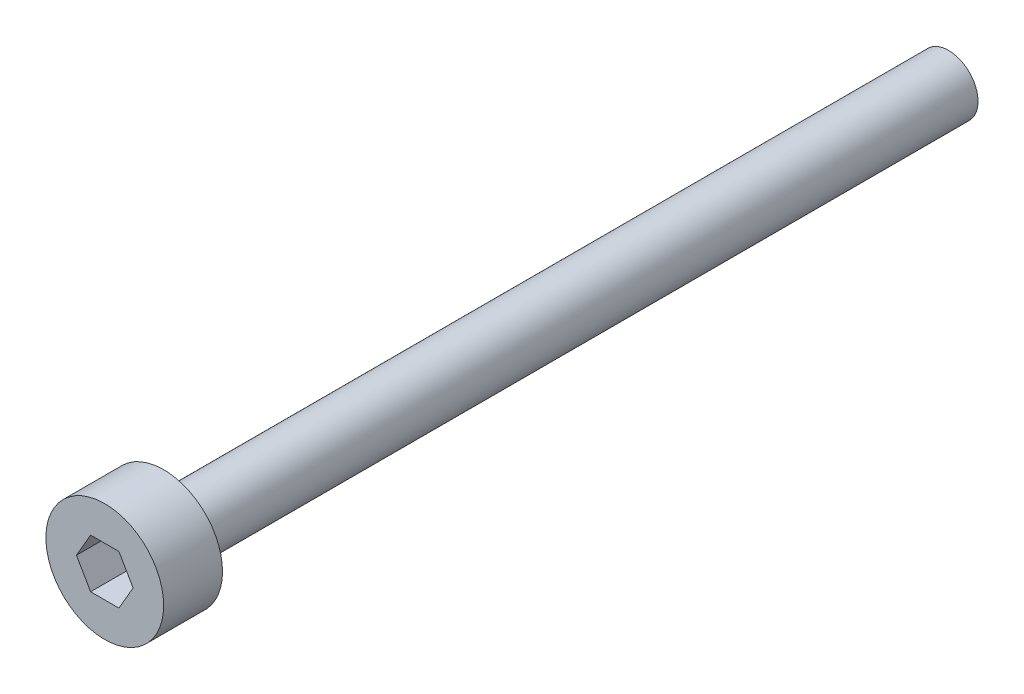
ISO-10303-21;
HEADER;
FILE_DESCRIPTION(('STEP AP214'),'2;1');
FILE_NAME('part.step','',(''),(''),'','','');
FILE_SCHEMA(('AUTOMOTIVE_DESIGN { 1 0 10303 214 1 1 1 1 }'));
ENDSEC;
DATA;
#1=APPLICATION_CONTEXT('core data for automotive mechanical design processes');
#2=APPLICATION_PROTOCOL_DEFINITION('international standard','automotive_design',2000,#1);
#3=PRODUCT_CONTEXT('',#1,'mechanical');
#4=PRODUCT('Part','Part','',(#3));
#5=PRODUCT_RELATED_PRODUCT_CATEGORY('part','',(#4));
#6=PRODUCT_DEFINITION_FORMATION('','',#4);
#7=PRODUCT_DEFINITION_CONTEXT('part definition',#1,'design');
#8=PRODUCT_DEFINITION('design','',#6,#7);
#9=PRODUCT_DEFINITION_SHAPE('','',#8);
#10=(LENGTH_UNIT() NAMED_UNIT(*) SI_UNIT(.MILLI.,.METRE.));
#11=(NAMED_UNIT(*) PLANE_ANGLE_UNIT() SI_UNIT($,.RADIAN.));
#12=(NAMED_UNIT(*) SI_UNIT($,.STERADIAN.) SOLID_ANGLE_UNIT());
#13=UNCERTAINTY_MEASURE_WITH_UNIT(LENGTH_MEASURE(1.E-05),#10,'distance_accuracy_value','');
#14=(GEOMETRIC_REPRESENTATION_CONTEXT(3) GLOBAL_UNCERTAINTY_ASSIGNED_CONTEXT((#13)) GLOBAL_UNIT_ASSIGNED_CONTEXT((#10,
#11,#12)) REPRESENTATION_CONTEXT('',''));
#15=CARTESIAN_POINT('',(0.,0.,0.));
#16=DIRECTION('',(0.,0.,1.));
#17=DIRECTION('',(1.,0.,0.));
#18=AXIS2_PLACEMENT_3D('',#15,#16,#17);
#19=CARTESIAN_POINT('',(0.,0.,3.));
#20=DIRECTION('',(0.,0.,-1.));
#21=DIRECTION('',(-1.,0.,0.));
#22=AXIS2_PLACEMENT_3D('',#19,#20,#21);
#23=CYLINDRICAL_SURFACE('',#22,3.);
#24=CARTESIAN_POINT('',(0.,0.,3.));
#25=DIRECTION('',(0.,0.,1.));
#26=DIRECTION('',(1.,0.,0.));
#27=AXIS2_PLACEMENT_3D('',#24,#25,#26);
#28=CIRCLE('',#27,3.);
#29=CARTESIAN_POINT('',(3.,0.,3.));
#30=VERTEX_POINT('',#29);
#31=EDGE_CURVE('E54',#30,#30,#28,.T.);
#32=ORIENTED_EDGE('',*,*,#31,.F.);
#33=EDGE_LOOP('',(#32));
#34=FACE_BOUND('',#33,.T.);
#35=CARTESIAN_POINT('',(0.,0.,0.));
#36=DIRECTION('',(0.,0.,1.));
#37=DIRECTION('',(1.,0.,0.));
#38=AXIS2_PLACEMENT_3D('',#35,#36,#37);
#39=CIRCLE('',#38,3.);
#40=CARTESIAN_POINT('',(3.,0.,0.));
#41=VERTEX_POINT('',#40);
#42=EDGE_CURVE('E48',#41,#41,#39,.T.);
#43=ORIENTED_EDGE('',*,*,#42,.T.);
#44=EDGE_LOOP('',(#43));
#45=FACE_BOUND('',#44,.T.);
#46=ADVANCED_FACE('F45',(#34,#45),#23,.T.);
#47=CARTESIAN_POINT('',(0.,0.,3.));
#48=DIRECTION('',(0.,0.,1.));
#49=DIRECTION('',(1.,0.,0.));
#50=AXIS2_PLACEMENT_3D('',#47,#48,#49);
#51=PLANE('',#50);
#52=DIRECTION('',(0.5,0.866025403784439,0.));
#53=VECTOR('',#52,1.);
#54=CARTESIAN_POINT('',(0.721687836487033,-1.25,3.));
#55=LINE('',#54,#53);
#56=CARTESIAN_POINT('',(0.721687836487033,-1.25,3.));
#57=VERTEX_POINT('',#56);
#58=CARTESIAN_POINT('',(1.44337567297407,0.,3.));
#59=VERTEX_POINT('',#58);
#60=EDGE_CURVE('E62',#57,#59,#55,.T.);
#61=ORIENTED_EDGE('',*,*,#60,.F.);
#62=DIRECTION('',(1.,0.,0.));
#63=VECTOR('',#62,1.);
#64=CARTESIAN_POINT('',(-0.721687836487031,-1.25,3.));
#65=LINE('',#64,#63);
#66=CARTESIAN_POINT('',(-0.721687836487031,-1.25,3.));
#67=VERTEX_POINT('',#66);
#68=EDGE_CURVE('E156',#67,#57,#65,.T.);
#69=ORIENTED_EDGE('',*,*,#68,.F.);
#70=DIRECTION('',(0.5,-0.866025403784438,0.));
#71=VECTOR('',#70,1.);
#72=CARTESIAN_POINT('',(-1.44337567297406,0.,3.));
#73=LINE('',#72,#71);
#74=CARTESIAN_POINT('',(-1.44337567297406,0.,3.));
#75=VERTEX_POINT('',#74);
#76=EDGE_CURVE('E153',#75,#67,#73,.T.);
#77=ORIENTED_EDGE('',*,*,#76,.F.);
#78=DIRECTION('',(-0.5,-0.866025403784439,0.));
#79=VECTOR('',#78,1.);
#80=CARTESIAN_POINT('',(-0.721687836487032,1.25,3.));
#81=LINE('',#80,#79);
#82=CARTESIAN_POINT('',(-0.721687836487032,1.25,3.));
#83=VERTEX_POINT('',#82);
#84=EDGE_CURVE('E110',#83,#75,#81,.T.);
#85=ORIENTED_EDGE('',*,*,#84,.F.);
#86=DIRECTION('',(-1.,0.,0.));
#87=VECTOR('',#86,1.);
#88=CARTESIAN_POINT('',(0.721687836487032,1.25,3.));
#89=LINE('',#88,#87);
#90=CARTESIAN_POINT('',(0.721687836487032,1.25,3.));
#91=VERTEX_POINT('',#90);
#92=EDGE_CURVE('E147',#91,#83,#89,.T.);
#93=ORIENTED_EDGE('',*,*,#92,.F.);
#94=DIRECTION('',(-0.5,0.866025403784438,0.));
#95=VECTOR('',#94,1.);
#96=CARTESIAN_POINT('',(1.44337567297406,0.,3.));
#97=LINE('',#96,#95);
#98=EDGE_CURVE('E142',#59,#91,#97,.T.);
#99=ORIENTED_EDGE('',*,*,#98,.F.);
#100=EDGE_LOOP('',(#61,#69,#77,#85,#93,#99));
#101=FACE_BOUND('',#100,.T.);
#102=ORIENTED_EDGE('',*,*,#31,.T.);
#103=EDGE_LOOP('',(#102));
#104=FACE_BOUND('',#103,.T.);
#105=ADVANCED_FACE('F182',(#101,#104),#51,.T.);
#106=CARTESIAN_POINT('',(0.,0.,0.));
#107=DIRECTION('',(0.,0.,1.));
#108=DIRECTION('',(1.,0.,0.));
#109=AXIS2_PLACEMENT_3D('',#106,#107,#108);
#110=PLANE('',#109);
#111=CARTESIAN_POINT('',(0.,0.,0.));
#112=DIRECTION('',(0.,0.,-1.));
#113=DIRECTION('',(-1.,0.,0.));
#114=AXIS2_PLACEMENT_3D('',#111,#112,#113);
#115=CIRCLE('',#114,1.5);
#116=CARTESIAN_POINT('',(-1.5,0.,0.));
#117=VERTEX_POINT('',#116);
#118=EDGE_CURVE('E11',#117,#117,#115,.T.);
#119=ORIENTED_EDGE('',*,*,#118,.F.);
#120=EDGE_LOOP('',(#119));
#121=FACE_BOUND('',#120,.T.);
#122=ORIENTED_EDGE('',*,*,#42,.F.);
#123=EDGE_LOOP('',(#122));
#124=FACE_BOUND('',#123,.T.);
#125=ADVANCED_FACE('F179',(#121,#124),#110,.F.);
#126=CARTESIAN_POINT('',(0.721687836487033,-1.25,1.));
#127=DIRECTION('',(0.866025403784439,-0.5,0.));
#128=DIRECTION('',(0.5,0.866025403784439,0.));
#129=AXIS2_PLACEMENT_3D('',#126,#127,#128);
#130=PLANE('',#129);
#131=ORIENTED_EDGE('',*,*,#60,.T.);
#132=DIRECTION('',(0.,0.,1.));
#133=VECTOR('',#132,1.);
#134=CARTESIAN_POINT('',(1.44337567297406,0.,1.));
#135=LINE('',#134,#133);
#136=CARTESIAN_POINT('',(1.44337567297406,0.,1.));
#137=VERTEX_POINT('',#136);
#138=EDGE_CURVE('E92',#137,#59,#135,.T.);
#139=ORIENTED_EDGE('',*,*,#138,.F.);
#140=DIRECTION('',(0.5,0.866025403784439,0.));
#141=VECTOR('',#140,1.);
#142=CARTESIAN_POINT('',(0.721687836487033,-1.25,1.));
#143=LINE('',#142,#141);
#144=CARTESIAN_POINT('',(0.721687836487033,-1.25,1.));
#145=VERTEX_POINT('',#144);
#146=EDGE_CURVE('E159',#145,#137,#143,.T.);
#147=ORIENTED_EDGE('',*,*,#146,.F.);
#148=DIRECTION('',(0.,0.,1.));
#149=VECTOR('',#148,1.);
#150=CARTESIAN_POINT('',(0.721687836487033,-1.25,1.));
#151=LINE('',#150,#149);
#152=EDGE_CURVE('E70',#145,#57,#151,.T.);
#153=ORIENTED_EDGE('',*,*,#152,.T.);
#154=EDGE_LOOP('',(#131,#139,#147,#153));
#155=FACE_BOUND('',#154,.T.);
#156=ADVANCED_FACE('F181',(#155),#130,.F.);
#157=CARTESIAN_POINT('',(-0.721687836487031,-1.25,1.));
#158=DIRECTION('',(0.,-1.,0.));
#159=DIRECTION('',(0.,0.,-1.));
#160=AXIS2_PLACEMENT_3D('',#157,#158,#159);
#161=PLANE('',#160);
#162=ORIENTED_EDGE('',*,*,#68,.T.);
#163=ORIENTED_EDGE('',*,*,#152,.F.);
#164=DIRECTION('',(1.,0.,0.));
#165=VECTOR('',#164,1.);
#166=CARTESIAN_POINT('',(-0.721687836487031,-1.25,1.));
#167=LINE('',#166,#165);
#168=CARTESIAN_POINT('',(-0.721687836487031,-1.25,1.));
#169=VERTEX_POINT('',#168);
#170=EDGE_CURVE('E124',#169,#145,#167,.T.);
#171=ORIENTED_EDGE('',*,*,#170,.F.);
#172=DIRECTION('',(0.,0.,1.));
#173=VECTOR('',#172,1.);
#174=CARTESIAN_POINT('',(-0.721687836487031,-1.25,1.));
#175=LINE('',#174,#173);
#176=EDGE_CURVE('E115',#169,#67,#175,.T.);
#177=ORIENTED_EDGE('',*,*,#176,.T.);
#178=EDGE_LOOP('',(#162,#163,#171,#177));
#179=FACE_BOUND('',#178,.T.);
#180=ADVANCED_FACE('F189',(#179),#161,.F.);
#181=CARTESIAN_POINT('',(-1.44337567297406,0.,1.));
#182=DIRECTION('',(-0.866025403784438,-0.5,0.));
#183=DIRECTION('',(0.5,-0.866025403784438,0.));
#184=AXIS2_PLACEMENT_3D('',#181,#182,#183);
#185=PLANE('',#184);
#186=ORIENTED_EDGE('',*,*,#76,.T.);
#187=ORIENTED_EDGE('',*,*,#176,.F.);
#188=DIRECTION('',(0.5,-0.866025403784438,0.));
#189=VECTOR('',#188,1.);
#190=CARTESIAN_POINT('',(-1.44337567297406,0.,1.));
#191=LINE('',#190,#189);
#192=CARTESIAN_POINT('',(-1.44337567297406,0.,1.));
#193=VERTEX_POINT('',#192);
#194=EDGE_CURVE('E119',#193,#169,#191,.T.);
#195=ORIENTED_EDGE('',*,*,#194,.F.);
#196=DIRECTION('',(0.,0.,1.));
#197=VECTOR('',#196,1.);
#198=CARTESIAN_POINT('',(-1.44337567297406,0.,1.));
#199=LINE('',#198,#197);
#200=EDGE_CURVE('E103',#193,#75,#199,.T.);
#201=ORIENTED_EDGE('',*,*,#200,.T.);
#202=EDGE_LOOP('',(#186,#187,#195,#201));
#203=FACE_BOUND('',#202,.T.);
#204=ADVANCED_FACE('F120',(#203),#185,.F.);
#205=CARTESIAN_POINT('',(-0.721687836487032,1.25,1.));
#206=DIRECTION('',(-0.866025403784439,0.5,0.));
#207=DIRECTION('',(-0.5,-0.866025403784439,0.));
#208=AXIS2_PLACEMENT_3D('',#205,#206,#207);
#209=PLANE('',#208);
#210=ORIENTED_EDGE('',*,*,#84,.T.);
#211=ORIENTED_EDGE('',*,*,#200,.F.);
#212=DIRECTION('',(-0.5,-0.866025403784439,0.));
#213=VECTOR('',#212,1.);
#214=CARTESIAN_POINT('',(-0.721687836487032,1.25,1.));
#215=LINE('',#214,#213);
#216=CARTESIAN_POINT('',(-0.721687836487032,1.25,1.));
#217=VERTEX_POINT('',#216);
#218=EDGE_CURVE('E107',#217,#193,#215,.T.);
#219=ORIENTED_EDGE('',*,*,#218,.F.);
#220=DIRECTION('',(0.,0.,1.));
#221=VECTOR('',#220,1.);
#222=CARTESIAN_POINT('',(-0.721687836487032,1.25,1.));
#223=LINE('',#222,#221);
#224=EDGE_CURVE('E116',#217,#83,#223,.T.);
#225=ORIENTED_EDGE('',*,*,#224,.T.);
#226=EDGE_LOOP('',(#210,#211,#219,#225));
#227=FACE_BOUND('',#226,.T.);
#228=ADVANCED_FACE('F105',(#227),#209,.F.);
#229=CARTESIAN_POINT('',(0.721687836487032,1.25,1.));
#230=DIRECTION('',(0.,1.,0.));
#231=DIRECTION('',(0.,0.,1.));
#232=AXIS2_PLACEMENT_3D('',#229,#230,#231);
#233=PLANE('',#232);
#234=ORIENTED_EDGE('',*,*,#92,.T.);
#235=ORIENTED_EDGE('',*,*,#224,.F.);
#236=DIRECTION('',(-1.,0.,0.));
#237=VECTOR('',#236,1.);
#238=CARTESIAN_POINT('',(0.721687836487032,1.25,1.));
#239=LINE('',#238,#237);
#240=CARTESIAN_POINT('',(0.721687836487032,1.25,1.));
#241=VERTEX_POINT('',#240);
#242=EDGE_CURVE('E130',#241,#217,#239,.T.);
#243=ORIENTED_EDGE('',*,*,#242,.F.);
#244=DIRECTION('',(0.,0.,1.));
#245=VECTOR('',#244,1.);
#246=CARTESIAN_POINT('',(0.721687836487032,1.25,1.));
#247=LINE('',#246,#245);
#248=EDGE_CURVE('E166',#241,#91,#247,.T.);
#249=ORIENTED_EDGE('',*,*,#248,.T.);
#250=EDGE_LOOP('',(#234,#235,#243,#249));
#251=FACE_BOUND('',#250,.T.);
#252=ADVANCED_FACE('F230',(#251),#233,.F.);
#253=CARTESIAN_POINT('',(1.44337567297406,0.,1.));
#254=DIRECTION('',(0.866025403784438,0.5,0.));
#255=DIRECTION('',(-0.5,0.866025403784438,0.));
#256=AXIS2_PLACEMENT_3D('',#253,#254,#255);
#257=PLANE('',#256);
#258=ORIENTED_EDGE('',*,*,#98,.T.);
#259=ORIENTED_EDGE('',*,*,#248,.F.);
#260=DIRECTION('',(-0.5,0.866025403784438,0.));
#261=VECTOR('',#260,1.);
#262=CARTESIAN_POINT('',(1.44337567297406,0.,1.));
#263=LINE('',#262,#261);
#264=EDGE_CURVE('E134',#137,#241,#263,.T.);
#265=ORIENTED_EDGE('',*,*,#264,.F.);
#266=ORIENTED_EDGE('',*,*,#138,.T.);
#267=EDGE_LOOP('',(#258,#259,#265,#266));
#268=FACE_BOUND('',#267,.T.);
#269=ADVANCED_FACE('F238',(#268),#257,.F.);
#270=CARTESIAN_POINT('',(0.,0.,1.));
#271=DIRECTION('',(0.,0.,1.));
#272=DIRECTION('',(1.,0.,0.));
#273=AXIS2_PLACEMENT_3D('',#270,#271,#272);
#274=PLANE('',#273);
#275=ORIENTED_EDGE('',*,*,#146,.T.);
#276=ORIENTED_EDGE('',*,*,#264,.T.);
#277=ORIENTED_EDGE('',*,*,#242,.T.);
#278=ORIENTED_EDGE('',*,*,#218,.T.);
#279=ORIENTED_EDGE('',*,*,#194,.T.);
#280=ORIENTED_EDGE('',*,*,#170,.T.);
#281=EDGE_LOOP('',(#275,#276,#277,#278,#279,#280));
#282=FACE_BOUND('',#281,.T.);
#283=ADVANCED_FACE('F127',(#282),#274,.T.);
#284=CARTESIAN_POINT('',(0.,0.,-40.));
#285=DIRECTION('',(0.,0.,1.));
#286=DIRECTION('',(1.,0.,0.));
#287=AXIS2_PLACEMENT_3D('',#284,#285,#286);
#288=CYLINDRICAL_SURFACE('',#287,1.5);
#289=CARTESIAN_POINT('',(0.,0.,-40.));
#290=DIRECTION('',(0.,0.,-1.));
#291=DIRECTION('',(-1.,0.,0.));
#292=AXIS2_PLACEMENT_3D('',#289,#290,#291);
#293=CIRCLE('',#292,1.5);
#294=CARTESIAN_POINT('',(-1.5,0.,-40.));
#295=VERTEX_POINT('',#294);
#296=EDGE_CURVE('E143',#295,#295,#293,.T.);
#297=ORIENTED_EDGE('',*,*,#296,.F.);
#298=EDGE_LOOP('',(#297));
#299=FACE_BOUND('',#298,.T.);
#300=ORIENTED_EDGE('',*,*,#118,.T.);
#301=EDGE_LOOP('',(#300));
#302=FACE_BOUND('',#301,.T.);
#303=ADVANCED_FACE('F253',(#299,#302),#288,.T.);
#304=CARTESIAN_POINT('',(0.,0.,-40.));
#305=DIRECTION('',(0.,0.,-1.));
#306=DIRECTION('',(-1.,0.,0.));
#307=AXIS2_PLACEMENT_3D('',#304,#305,#306);
#308=PLANE('',#307);
#309=ORIENTED_EDGE('',*,*,#296,.T.);
#310=EDGE_LOOP('',(#309));
#311=FACE_BOUND('',#310,.T.);
#312=ADVANCED_FACE('F264',(#311),#308,.T.);
#313=CLOSED_SHELL('',(#46,#105,#125,#156,#180,#204,#228,#252,#269,#283,#303,#312));
#314=MANIFOLD_SOLID_BREP('B2',#313);
#315=ADVANCED_BREP_SHAPE_REPRESENTATION('',(#18,#314),#14);
#316=SHAPE_DEFINITION_REPRESENTATION(#9,#315);
ENDSEC;
END-ISO-10303-21;
